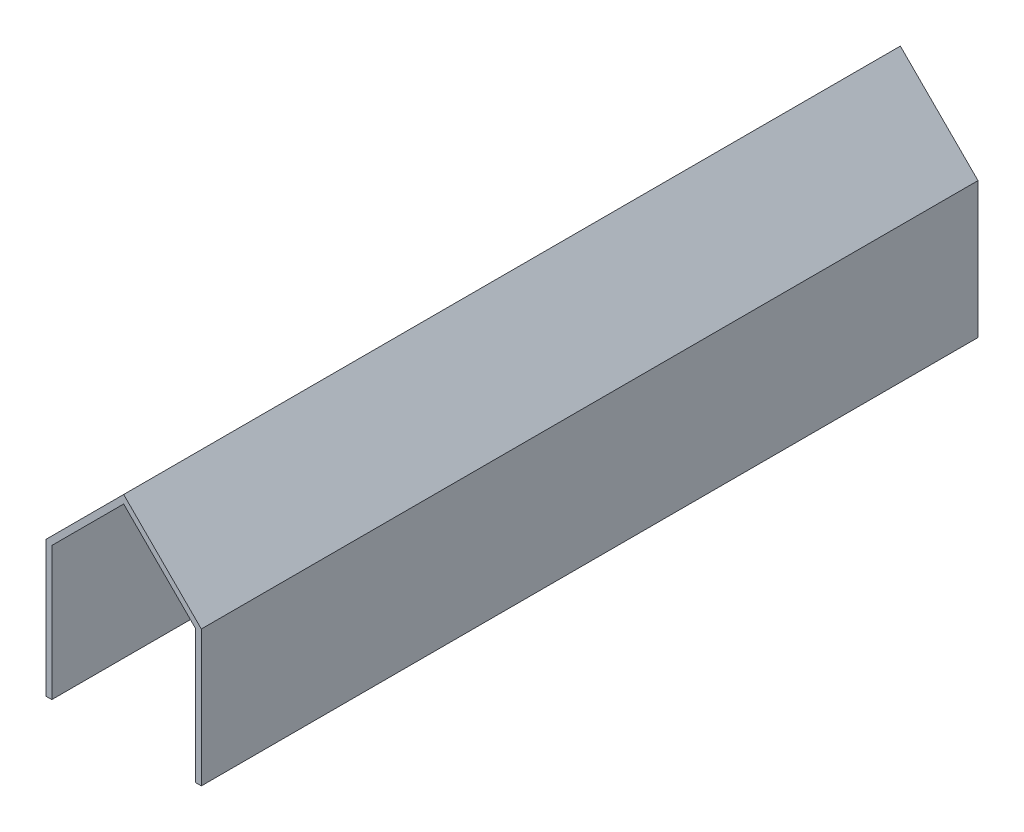
ISO-10303-21;
HEADER;
FILE_DESCRIPTION(('STEP AP214'),'2;1');
FILE_NAME('part.step','',(''),(''),'','','');
FILE_SCHEMA(('AUTOMOTIVE_DESIGN { 1 0 10303 214 1 1 1 1 }'));
ENDSEC;
DATA;
#1=APPLICATION_CONTEXT('core data for automotive mechanical design processes');
#2=APPLICATION_PROTOCOL_DEFINITION('international standard','automotive_design',2000,#1);
#3=PRODUCT_CONTEXT('',#1,'mechanical');
#4=PRODUCT('Part','Part','',(#3));
#5=PRODUCT_RELATED_PRODUCT_CATEGORY('part','',(#4));
#6=PRODUCT_DEFINITION_FORMATION('','',#4);
#7=PRODUCT_DEFINITION_CONTEXT('part definition',#1,'design');
#8=PRODUCT_DEFINITION('design','',#6,#7);
#9=PRODUCT_DEFINITION_SHAPE('','',#8);
#10=(LENGTH_UNIT() NAMED_UNIT(*) SI_UNIT(.MILLI.,.METRE.));
#11=(NAMED_UNIT(*) PLANE_ANGLE_UNIT() SI_UNIT($,.RADIAN.));
#12=(NAMED_UNIT(*) SI_UNIT($,.STERADIAN.) SOLID_ANGLE_UNIT());
#13=UNCERTAINTY_MEASURE_WITH_UNIT(LENGTH_MEASURE(1.E-05),#10,'distance_accuracy_value','');
#14=(GEOMETRIC_REPRESENTATION_CONTEXT(3) GLOBAL_UNCERTAINTY_ASSIGNED_CONTEXT((#13)) GLOBAL_UNIT_ASSIGNED_CONTEXT((#10,
#11,#12)) REPRESENTATION_CONTEXT('',''));
#15=CARTESIAN_POINT('',(0.,0.,0.));
#16=DIRECTION('',(0.,0.,1.));
#17=DIRECTION('',(1.,0.,0.));
#18=AXIS2_PLACEMENT_3D('',#15,#16,#17);
#19=CARTESIAN_POINT('',(-40.,0.,400.));
#20=DIRECTION('',(0.,1.,0.));
#21=DIRECTION('',(0.,0.,1.));
#22=AXIS2_PLACEMENT_3D('',#19,#20,#21);
#23=PLANE('',#22);
#24=DIRECTION('',(1.,0.,0.));
#25=VECTOR('',#24,1.);
#26=CARTESIAN_POINT('',(-40.,0.,0.));
#27=LINE('',#26,#25);
#28=CARTESIAN_POINT('',(-40.,0.,0.));
#29=VERTEX_POINT('',#28);
#30=CARTESIAN_POINT('',(-37.,0.,0.));
#31=VERTEX_POINT('',#30);
#32=EDGE_CURVE('E141',#29,#31,#27,.T.);
#33=ORIENTED_EDGE('',*,*,#32,.T.);
#34=DIRECTION('',(0.,0.,-1.));
#35=VECTOR('',#34,1.);
#36=CARTESIAN_POINT('',(-37.,0.,400.));
#37=LINE('',#36,#35);
#38=CARTESIAN_POINT('',(-37.,0.,400.));
#39=VERTEX_POINT('',#38);
#40=EDGE_CURVE('E11',#39,#31,#37,.T.);
#41=ORIENTED_EDGE('',*,*,#40,.F.);
#42=DIRECTION('',(1.,0.,0.));
#43=VECTOR('',#42,1.);
#44=CARTESIAN_POINT('',(-40.,0.,400.));
#45=LINE('',#44,#43);
#46=CARTESIAN_POINT('',(-40.,0.,400.));
#47=VERTEX_POINT('',#46);
#48=EDGE_CURVE('E159',#47,#39,#45,.T.);
#49=ORIENTED_EDGE('',*,*,#48,.F.);
#50=DIRECTION('',(0.,0.,-1.));
#51=VECTOR('',#50,1.);
#52=CARTESIAN_POINT('',(-40.,0.,400.));
#53=LINE('',#52,#51);
#54=EDGE_CURVE('E137',#47,#29,#53,.T.);
#55=ORIENTED_EDGE('',*,*,#54,.T.);
#56=EDGE_LOOP('',(#33,#41,#49,#55));
#57=FACE_BOUND('',#56,.T.);
#58=ADVANCED_FACE('F33',(#57),#23,.F.);
#59=CARTESIAN_POINT('',(-37.,0.,400.));
#60=DIRECTION('',(-1.,0.,0.));
#61=DIRECTION('',(0.,-1.,0.));
#62=AXIS2_PLACEMENT_3D('',#59,#60,#61);
#63=PLANE('',#62);
#64=DIRECTION('',(0.,1.,0.));
#65=VECTOR('',#64,1.);
#66=CARTESIAN_POINT('',(-37.,0.,0.));
#67=LINE('',#66,#65);
#68=CARTESIAN_POINT('',(-37.,68.7573593128807,0.));
#69=VERTEX_POINT('',#68);
#70=EDGE_CURVE('E144',#31,#69,#67,.T.);
#71=ORIENTED_EDGE('',*,*,#70,.T.);
#72=DIRECTION('',(0.,0.,-1.));
#73=VECTOR('',#72,1.);
#74=CARTESIAN_POINT('',(-37.,68.7573593128807,400.));
#75=LINE('',#74,#73);
#76=CARTESIAN_POINT('',(-37.,68.7573593128807,400.));
#77=VERTEX_POINT('',#76);
#78=EDGE_CURVE('E41',#77,#69,#75,.T.);
#79=ORIENTED_EDGE('',*,*,#78,.F.);
#80=DIRECTION('',(0.,1.,0.));
#81=VECTOR('',#80,1.);
#82=CARTESIAN_POINT('',(-37.,0.,400.));
#83=LINE('',#82,#81);
#84=EDGE_CURVE('E98',#39,#77,#83,.T.);
#85=ORIENTED_EDGE('',*,*,#84,.F.);
#86=ORIENTED_EDGE('',*,*,#40,.T.);
#87=EDGE_LOOP('',(#71,#79,#85,#86));
#88=FACE_BOUND('',#87,.T.);
#89=ADVANCED_FACE('F208',(#88),#63,.F.);
#90=CARTESIAN_POINT('',(-37.,68.7573593128807,400.));
#91=DIRECTION('',(-0.707106781186548,0.707106781186547,0.));
#92=DIRECTION('',(-0.707106781186547,-0.707106781186548,0.));
#93=AXIS2_PLACEMENT_3D('',#90,#91,#92);
#94=PLANE('',#93);
#95=DIRECTION('',(0.707106781186547,0.707106781186548,0.));
#96=VECTOR('',#95,1.);
#97=CARTESIAN_POINT('',(-37.,68.7573593128807,0.));
#98=LINE('',#97,#96);
#99=CARTESIAN_POINT('',(0.,105.757359312881,0.));
#100=VERTEX_POINT('',#99);
#101=EDGE_CURVE('E146',#69,#100,#98,.T.);
#102=ORIENTED_EDGE('',*,*,#101,.T.);
#103=DIRECTION('',(0.,0.,-1.));
#104=VECTOR('',#103,1.);
#105=CARTESIAN_POINT('',(0.,105.757359312881,400.));
#106=LINE('',#105,#104);
#107=CARTESIAN_POINT('',(0.,105.757359312881,400.));
#108=VERTEX_POINT('',#107);
#109=EDGE_CURVE('E172',#108,#100,#106,.T.);
#110=ORIENTED_EDGE('',*,*,#109,.F.);
#111=DIRECTION('',(0.707106781186547,0.707106781186548,0.));
#112=VECTOR('',#111,1.);
#113=CARTESIAN_POINT('',(-37.,68.7573593128807,400.));
#114=LINE('',#113,#112);
#115=EDGE_CURVE('E180',#77,#108,#114,.T.);
#116=ORIENTED_EDGE('',*,*,#115,.F.);
#117=ORIENTED_EDGE('',*,*,#78,.T.);
#118=EDGE_LOOP('',(#102,#110,#116,#117));
#119=FACE_BOUND('',#118,.T.);
#120=ADVANCED_FACE('F178',(#119),#94,.F.);
#121=CARTESIAN_POINT('',(37.,68.7573593128808,400.));
#122=DIRECTION('',(0.707106781186548,0.707106781186548,0.));
#123=DIRECTION('',(-0.707106781186548,0.707106781186548,0.));
#124=AXIS2_PLACEMENT_3D('',#121,#122,#123);
#125=PLANE('',#124);
#126=DIRECTION('',(0.707106781186548,-0.707106781186548,0.));
#127=VECTOR('',#126,1.);
#128=CARTESIAN_POINT('',(37.,68.7573593128808,0.));
#129=LINE('',#128,#127);
#130=CARTESIAN_POINT('',(37.,68.7573593128808,0.));
#131=VERTEX_POINT('',#130);
#132=EDGE_CURVE('E148',#100,#131,#129,.T.);
#133=ORIENTED_EDGE('',*,*,#132,.T.);
#134=DIRECTION('',(0.,0.,-1.));
#135=VECTOR('',#134,1.);
#136=CARTESIAN_POINT('',(37.,68.7573593128808,400.));
#137=LINE('',#136,#135);
#138=CARTESIAN_POINT('',(37.,68.7573593128808,400.));
#139=VERTEX_POINT('',#138);
#140=EDGE_CURVE('E169',#139,#131,#137,.T.);
#141=ORIENTED_EDGE('',*,*,#140,.F.);
#142=DIRECTION('',(0.707106781186548,-0.707106781186548,0.));
#143=VECTOR('',#142,1.);
#144=CARTESIAN_POINT('',(37.,68.7573593128808,400.));
#145=LINE('',#144,#143);
#146=EDGE_CURVE('E198',#108,#139,#145,.T.);
#147=ORIENTED_EDGE('',*,*,#146,.F.);
#148=ORIENTED_EDGE('',*,*,#109,.T.);
#149=EDGE_LOOP('',(#133,#141,#147,#148));
#150=FACE_BOUND('',#149,.T.);
#151=ADVANCED_FACE('F189',(#150),#125,.F.);
#152=CARTESIAN_POINT('',(37.,0.,400.));
#153=DIRECTION('',(1.,0.,0.));
#154=DIRECTION('',(0.,1.,0.));
#155=AXIS2_PLACEMENT_3D('',#152,#153,#154);
#156=PLANE('',#155);
#157=DIRECTION('',(0.,-1.,0.));
#158=VECTOR('',#157,1.);
#159=CARTESIAN_POINT('',(37.,0.,0.));
#160=LINE('',#159,#158);
#161=CARTESIAN_POINT('',(37.,0.,0.));
#162=VERTEX_POINT('',#161);
#163=EDGE_CURVE('E150',#131,#162,#160,.T.);
#164=ORIENTED_EDGE('',*,*,#163,.T.);
#165=DIRECTION('',(0.,0.,-1.));
#166=VECTOR('',#165,1.);
#167=CARTESIAN_POINT('',(37.,0.,400.));
#168=LINE('',#167,#166);
#169=CARTESIAN_POINT('',(37.,0.,400.));
#170=VERTEX_POINT('',#169);
#171=EDGE_CURVE('E166',#170,#162,#168,.T.);
#172=ORIENTED_EDGE('',*,*,#171,.F.);
#173=DIRECTION('',(0.,-1.,0.));
#174=VECTOR('',#173,1.);
#175=CARTESIAN_POINT('',(37.,0.,400.));
#176=LINE('',#175,#174);
#177=EDGE_CURVE('E195',#139,#170,#176,.T.);
#178=ORIENTED_EDGE('',*,*,#177,.F.);
#179=ORIENTED_EDGE('',*,*,#140,.T.);
#180=EDGE_LOOP('',(#164,#172,#178,#179));
#181=FACE_BOUND('',#180,.T.);
#182=ADVANCED_FACE('F193',(#181),#156,.F.);
#183=CARTESIAN_POINT('',(40.,0.,400.));
#184=DIRECTION('',(0.,1.,0.));
#185=DIRECTION('',(0.,0.,1.));
#186=AXIS2_PLACEMENT_3D('',#183,#184,#185);
#187=PLANE('',#186);
#188=DIRECTION('',(1.,0.,0.));
#189=VECTOR('',#188,1.);
#190=CARTESIAN_POINT('',(40.,0.,0.));
#191=LINE('',#190,#189);
#192=CARTESIAN_POINT('',(40.,0.,0.));
#193=VERTEX_POINT('',#192);
#194=EDGE_CURVE('E152',#162,#193,#191,.T.);
#195=ORIENTED_EDGE('',*,*,#194,.T.);
#196=DIRECTION('',(0.,0.,-1.));
#197=VECTOR('',#196,1.);
#198=CARTESIAN_POINT('',(40.,0.,400.));
#199=LINE('',#198,#197);
#200=CARTESIAN_POINT('',(40.,0.,400.));
#201=VERTEX_POINT('',#200);
#202=EDGE_CURVE('E163',#201,#193,#199,.T.);
#203=ORIENTED_EDGE('',*,*,#202,.F.);
#204=DIRECTION('',(1.,0.,0.));
#205=VECTOR('',#204,1.);
#206=CARTESIAN_POINT('',(40.,0.,400.));
#207=LINE('',#206,#205);
#208=EDGE_CURVE('E197',#170,#201,#207,.T.);
#209=ORIENTED_EDGE('',*,*,#208,.F.);
#210=ORIENTED_EDGE('',*,*,#171,.T.);
#211=EDGE_LOOP('',(#195,#203,#209,#210));
#212=FACE_BOUND('',#211,.T.);
#213=ADVANCED_FACE('F220',(#212),#187,.F.);
#214=CARTESIAN_POINT('',(40.,70.,400.));
#215=DIRECTION('',(-1.,0.,0.));
#216=DIRECTION('',(0.,-1.,0.));
#217=AXIS2_PLACEMENT_3D('',#214,#215,#216);
#218=PLANE('',#217);
#219=DIRECTION('',(0.,1.,0.));
#220=VECTOR('',#219,1.);
#221=CARTESIAN_POINT('',(40.,70.,0.));
#222=LINE('',#221,#220);
#223=CARTESIAN_POINT('',(40.,70.,0.));
#224=VERTEX_POINT('',#223);
#225=EDGE_CURVE('E154',#193,#224,#222,.T.);
#226=ORIENTED_EDGE('',*,*,#225,.T.);
#227=DIRECTION('',(0.,0.,-1.));
#228=VECTOR('',#227,1.);
#229=CARTESIAN_POINT('',(40.,70.,400.));
#230=LINE('',#229,#228);
#231=CARTESIAN_POINT('',(40.,70.,400.));
#232=VERTEX_POINT('',#231);
#233=EDGE_CURVE('E132',#232,#224,#230,.T.);
#234=ORIENTED_EDGE('',*,*,#233,.F.);
#235=DIRECTION('',(0.,1.,0.));
#236=VECTOR('',#235,1.);
#237=CARTESIAN_POINT('',(40.,70.,400.));
#238=LINE('',#237,#236);
#239=EDGE_CURVE('E123',#201,#232,#238,.T.);
#240=ORIENTED_EDGE('',*,*,#239,.F.);
#241=ORIENTED_EDGE('',*,*,#202,.T.);
#242=EDGE_LOOP('',(#226,#234,#240,#241));
#243=FACE_BOUND('',#242,.T.);
#244=ADVANCED_FACE('F223',(#243),#218,.F.);
#245=CARTESIAN_POINT('',(0.,110.,400.));
#246=DIRECTION('',(-0.707106781186548,-0.707106781186547,0.));
#247=DIRECTION('',(0.707106781186547,-0.707106781186548,0.));
#248=AXIS2_PLACEMENT_3D('',#245,#246,#247);
#249=PLANE('',#248);
#250=DIRECTION('',(-0.707106781186547,0.707106781186548,0.));
#251=VECTOR('',#250,1.);
#252=CARTESIAN_POINT('',(0.,110.,0.));
#253=LINE('',#252,#251);
#254=CARTESIAN_POINT('',(0.,110.,0.));
#255=VERTEX_POINT('',#254);
#256=EDGE_CURVE('E131',#224,#255,#253,.T.);
#257=ORIENTED_EDGE('',*,*,#256,.T.);
#258=DIRECTION('',(0.,0.,-1.));
#259=VECTOR('',#258,1.);
#260=CARTESIAN_POINT('',(0.,110.,400.));
#261=LINE('',#260,#259);
#262=CARTESIAN_POINT('',(0.,110.,400.));
#263=VERTEX_POINT('',#262);
#264=EDGE_CURVE('E128',#263,#255,#261,.T.);
#265=ORIENTED_EDGE('',*,*,#264,.F.);
#266=DIRECTION('',(-0.707106781186547,0.707106781186548,0.));
#267=VECTOR('',#266,1.);
#268=CARTESIAN_POINT('',(0.,110.,400.));
#269=LINE('',#268,#267);
#270=EDGE_CURVE('E117',#232,#263,#269,.T.);
#271=ORIENTED_EDGE('',*,*,#270,.F.);
#272=ORIENTED_EDGE('',*,*,#233,.T.);
#273=EDGE_LOOP('',(#257,#265,#271,#272));
#274=FACE_BOUND('',#273,.T.);
#275=ADVANCED_FACE('F129',(#274),#249,.F.);
#276=CARTESIAN_POINT('',(0.,110.,400.));
#277=DIRECTION('',(0.707106781186548,-0.707106781186547,0.));
#278=DIRECTION('',(0.707106781186547,0.707106781186548,0.));
#279=AXIS2_PLACEMENT_3D('',#276,#277,#278);
#280=PLANE('',#279);
#281=DIRECTION('',(-0.707106781186547,-0.707106781186548,0.));
#282=VECTOR('',#281,1.);
#283=CARTESIAN_POINT('',(0.,110.,0.));
#284=LINE('',#283,#282);
#285=CARTESIAN_POINT('',(-40.,70.,0.));
#286=VERTEX_POINT('',#285);
#287=EDGE_CURVE('E84',#255,#286,#284,.T.);
#288=ORIENTED_EDGE('',*,*,#287,.T.);
#289=DIRECTION('',(0.,0.,-1.));
#290=VECTOR('',#289,1.);
#291=CARTESIAN_POINT('',(-40.,70.,400.));
#292=LINE('',#291,#290);
#293=CARTESIAN_POINT('',(-40.,70.,400.));
#294=VERTEX_POINT('',#293);
#295=EDGE_CURVE('E133',#294,#286,#292,.T.);
#296=ORIENTED_EDGE('',*,*,#295,.F.);
#297=DIRECTION('',(-0.707106781186547,-0.707106781186548,0.));
#298=VECTOR('',#297,1.);
#299=CARTESIAN_POINT('',(0.,110.,400.));
#300=LINE('',#299,#298);
#301=EDGE_CURVE('E121',#263,#294,#300,.T.);
#302=ORIENTED_EDGE('',*,*,#301,.F.);
#303=ORIENTED_EDGE('',*,*,#264,.T.);
#304=EDGE_LOOP('',(#288,#296,#302,#303));
#305=FACE_BOUND('',#304,.T.);
#306=ADVANCED_FACE('F135',(#305),#280,.F.);
#307=CARTESIAN_POINT('',(-40.,70.,400.));
#308=DIRECTION('',(1.,0.,0.));
#309=DIRECTION('',(0.,1.,0.));
#310=AXIS2_PLACEMENT_3D('',#307,#308,#309);
#311=PLANE('',#310);
#312=DIRECTION('',(0.,-1.,0.));
#313=VECTOR('',#312,1.);
#314=CARTESIAN_POINT('',(-40.,70.,0.));
#315=LINE('',#314,#313);
#316=EDGE_CURVE('E90',#286,#29,#315,.T.);
#317=ORIENTED_EDGE('',*,*,#316,.T.);
#318=ORIENTED_EDGE('',*,*,#54,.F.);
#319=DIRECTION('',(0.,-1.,0.));
#320=VECTOR('',#319,1.);
#321=CARTESIAN_POINT('',(-40.,70.,400.));
#322=LINE('',#321,#320);
#323=EDGE_CURVE('E49',#294,#47,#322,.T.);
#324=ORIENTED_EDGE('',*,*,#323,.F.);
#325=ORIENTED_EDGE('',*,*,#295,.T.);
#326=EDGE_LOOP('',(#317,#318,#324,#325));
#327=FACE_BOUND('',#326,.T.);
#328=ADVANCED_FACE('F232',(#327),#311,.F.);
#329=CARTESIAN_POINT('',(0.,0.,400.));
#330=DIRECTION('',(0.,0.,1.));
#331=DIRECTION('',(1.,0.,0.));
#332=AXIS2_PLACEMENT_3D('',#329,#330,#331);
#333=PLANE('',#332);
#334=ORIENTED_EDGE('',*,*,#48,.T.);
#335=ORIENTED_EDGE('',*,*,#84,.T.);
#336=ORIENTED_EDGE('',*,*,#115,.T.);
#337=ORIENTED_EDGE('',*,*,#146,.T.);
#338=ORIENTED_EDGE('',*,*,#177,.T.);
#339=ORIENTED_EDGE('',*,*,#208,.T.);
#340=ORIENTED_EDGE('',*,*,#239,.T.);
#341=ORIENTED_EDGE('',*,*,#270,.T.);
#342=ORIENTED_EDGE('',*,*,#301,.T.);
#343=ORIENTED_EDGE('',*,*,#323,.T.);
#344=EDGE_LOOP('',(#334,#335,#336,#337,#338,#339,#340,#341,#342,#343));
#345=FACE_BOUND('',#344,.T.);
#346=ADVANCED_FACE('F119',(#345),#333,.T.);
#347=CARTESIAN_POINT('',(0.,0.,0.));
#348=DIRECTION('',(0.,0.,1.));
#349=DIRECTION('',(1.,0.,0.));
#350=AXIS2_PLACEMENT_3D('',#347,#348,#349);
#351=PLANE('',#350);
#352=ORIENTED_EDGE('',*,*,#32,.F.);
#353=ORIENTED_EDGE('',*,*,#316,.F.);
#354=ORIENTED_EDGE('',*,*,#287,.F.);
#355=ORIENTED_EDGE('',*,*,#256,.F.);
#356=ORIENTED_EDGE('',*,*,#225,.F.);
#357=ORIENTED_EDGE('',*,*,#194,.F.);
#358=ORIENTED_EDGE('',*,*,#163,.F.);
#359=ORIENTED_EDGE('',*,*,#132,.F.);
#360=ORIENTED_EDGE('',*,*,#101,.F.);
#361=ORIENTED_EDGE('',*,*,#70,.F.);
#362=EDGE_LOOP('',(#352,#353,#354,#355,#356,#357,#358,#359,#360,#361));
#363=FACE_BOUND('',#362,.T.);
#364=ADVANCED_FACE('F184',(#363),#351,.F.);
#365=CLOSED_SHELL('',(#58,#89,#120,#151,#182,#213,#244,#275,#306,#328,#346,#364));
#366=MANIFOLD_SOLID_BREP('B2',#365);
#367=ADVANCED_BREP_SHAPE_REPRESENTATION('',(#18,#366),#14);
#368=SHAPE_DEFINITION_REPRESENTATION(#9,#367);
ENDSEC;
END-ISO-10303-21;
